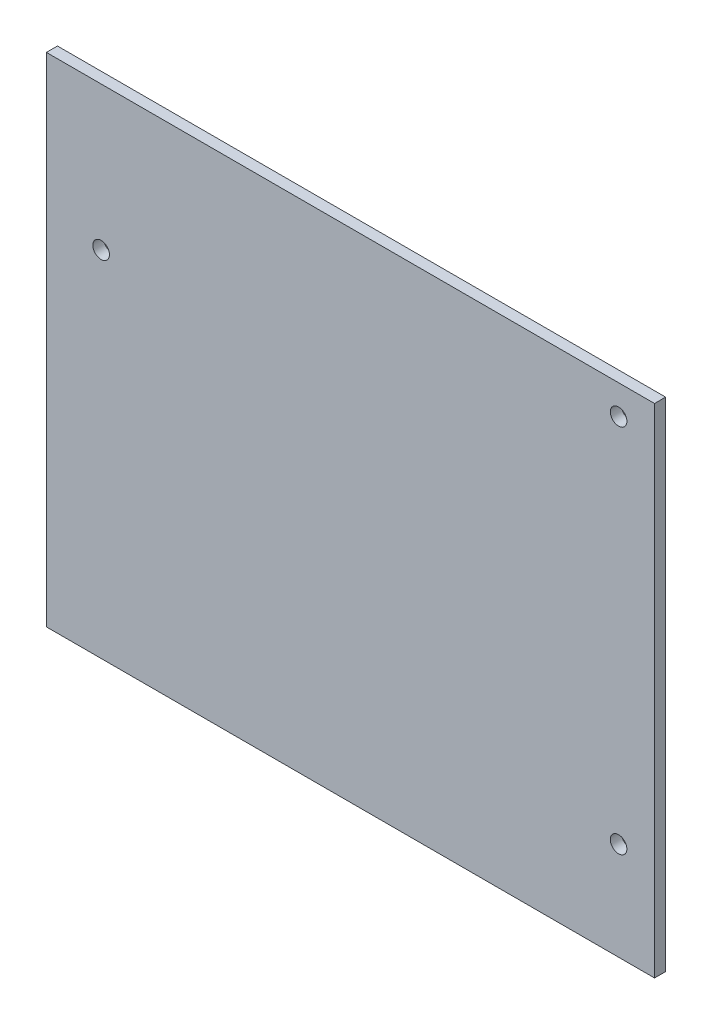
ISO-10303-21;
HEADER;
FILE_DESCRIPTION(('STEP AP214'),'2;1');
FILE_NAME('part.step','',(''),(''),'','','');
FILE_SCHEMA(('AUTOMOTIVE_DESIGN { 1 0 10303 214 1 1 1 1 }'));
ENDSEC;
DATA;
#1=APPLICATION_CONTEXT('core data for automotive mechanical design processes');
#2=APPLICATION_PROTOCOL_DEFINITION('international standard','automotive_design',2000,#1);
#3=PRODUCT_CONTEXT('',#1,'mechanical');
#4=PRODUCT('Part','Part','',(#3));
#5=PRODUCT_RELATED_PRODUCT_CATEGORY('part','',(#4));
#6=PRODUCT_DEFINITION_FORMATION('','',#4);
#7=PRODUCT_DEFINITION_CONTEXT('part definition',#1,'design');
#8=PRODUCT_DEFINITION('design','',#6,#7);
#9=PRODUCT_DEFINITION_SHAPE('','',#8);
#10=(LENGTH_UNIT() NAMED_UNIT(*) SI_UNIT(.MILLI.,.METRE.));
#11=(NAMED_UNIT(*) PLANE_ANGLE_UNIT() SI_UNIT($,.RADIAN.));
#12=(NAMED_UNIT(*) SI_UNIT($,.STERADIAN.) SOLID_ANGLE_UNIT());
#13=UNCERTAINTY_MEASURE_WITH_UNIT(LENGTH_MEASURE(1.E-05),#10,'distance_accuracy_value','');
#14=(GEOMETRIC_REPRESENTATION_CONTEXT(3) GLOBAL_UNCERTAINTY_ASSIGNED_CONTEXT((#13)) GLOBAL_UNIT_ASSIGNED_CONTEXT((#10,
#11,#12)) REPRESENTATION_CONTEXT('',''));
#15=CARTESIAN_POINT('',(0.,0.,0.));
#16=DIRECTION('',(0.,0.,1.));
#17=DIRECTION('',(1.,0.,0.));
#18=AXIS2_PLACEMENT_3D('',#15,#16,#17);
#19=CARTESIAN_POINT('',(55.,45.,2.));
#20=DIRECTION('',(0.,0.,-1.));
#21=DIRECTION('',(-1.,0.,0.));
#22=AXIS2_PLACEMENT_3D('',#19,#20,#21);
#23=PLANE('',#22);
#24=CARTESIAN_POINT('',(-45.1,19.,2.));
#25=DIRECTION('',(0.,0.,1.));
#26=DIRECTION('',(1.,0.,0.));
#27=AXIS2_PLACEMENT_3D('',#24,#25,#26);
#28=CIRCLE('',#27,1.5);
#29=CARTESIAN_POINT('',(-43.6,19.,2.));
#30=VERTEX_POINT('',#29);
#31=EDGE_CURVE('E114',#30,#30,#28,.T.);
#32=ORIENTED_EDGE('',*,*,#31,.F.);
#33=EDGE_LOOP('',(#32));
#34=FACE_BOUND('',#33,.T.);
#35=DIRECTION('',(0.,1.,0.));
#36=VECTOR('',#35,1.);
#37=CARTESIAN_POINT('',(55.,-45.,2.));
#38=LINE('',#37,#36);
#39=CARTESIAN_POINT('',(55.,-45.,2.));
#40=VERTEX_POINT('',#39);
#41=CARTESIAN_POINT('',(55.,45.,2.));
#42=VERTEX_POINT('',#41);
#43=EDGE_CURVE('E84',#40,#42,#38,.T.);
#44=ORIENTED_EDGE('',*,*,#43,.T.);
#45=DIRECTION('',(-1.,0.,0.));
#46=VECTOR('',#45,1.);
#47=CARTESIAN_POINT('',(-55.,45.,2.));
#48=LINE('',#47,#46);
#49=CARTESIAN_POINT('',(-55.,45.,2.));
#50=VERTEX_POINT('',#49);
#51=EDGE_CURVE('E79',#42,#50,#48,.T.);
#52=ORIENTED_EDGE('',*,*,#51,.T.);
#53=DIRECTION('',(0.,-1.,0.));
#54=VECTOR('',#53,1.);
#55=CARTESIAN_POINT('',(-55.,-45.,2.));
#56=LINE('',#55,#54);
#57=CARTESIAN_POINT('',(-55.,-45.,2.));
#58=VERTEX_POINT('',#57);
#59=EDGE_CURVE('E82',#50,#58,#56,.T.);
#60=ORIENTED_EDGE('',*,*,#59,.T.);
#61=DIRECTION('',(1.,0.,0.));
#62=VECTOR('',#61,1.);
#63=CARTESIAN_POINT('',(-55.,-45.,2.));
#64=LINE('',#63,#62);
#65=EDGE_CURVE('E49',#58,#40,#64,.T.);
#66=ORIENTED_EDGE('',*,*,#65,.T.);
#67=EDGE_LOOP('',(#44,#52,#60,#66));
#68=FACE_BOUND('',#67,.T.);
#69=CARTESIAN_POINT('',(48.5,39.7,2.));
#70=DIRECTION('',(0.,0.,1.));
#71=DIRECTION('',(1.,0.,0.));
#72=AXIS2_PLACEMENT_3D('',#69,#70,#71);
#73=CIRCLE('',#72,1.5);
#74=CARTESIAN_POINT('',(50.,39.7,2.));
#75=VERTEX_POINT('',#74);
#76=EDGE_CURVE('E99',#75,#75,#73,.T.);
#77=ORIENTED_EDGE('',*,*,#76,.F.);
#78=EDGE_LOOP('',(#77));
#79=FACE_BOUND('',#78,.T.);
#80=CARTESIAN_POINT('',(48.5,-27.3,2.));
#81=DIRECTION('',(0.,0.,1.));
#82=DIRECTION('',(1.,0.,0.));
#83=AXIS2_PLACEMENT_3D('',#80,#81,#82);
#84=CIRCLE('',#83,1.5);
#85=CARTESIAN_POINT('',(50.,-27.3,2.));
#86=VERTEX_POINT('',#85);
#87=EDGE_CURVE('E120',#86,#86,#84,.T.);
#88=ORIENTED_EDGE('',*,*,#87,.F.);
#89=EDGE_LOOP('',(#88));
#90=FACE_BOUND('',#89,.T.);
#91=ADVANCED_FACE('F32',(#34,#68,#79,#90),#23,.F.);
#92=CARTESIAN_POINT('',(55.,45.,0.));
#93=DIRECTION('',(0.,0.,-1.));
#94=DIRECTION('',(-1.,0.,0.));
#95=AXIS2_PLACEMENT_3D('',#92,#93,#94);
#96=PLANE('',#95);
#97=CARTESIAN_POINT('',(-45.1,19.,0.));
#98=DIRECTION('',(0.,0.,1.));
#99=DIRECTION('',(1.,0.,0.));
#100=AXIS2_PLACEMENT_3D('',#97,#98,#99);
#101=CIRCLE('',#100,1.5);
#102=CARTESIAN_POINT('',(-43.6,19.,0.));
#103=VERTEX_POINT('',#102);
#104=EDGE_CURVE('E117',#103,#103,#101,.T.);
#105=ORIENTED_EDGE('',*,*,#104,.T.);
#106=EDGE_LOOP('',(#105));
#107=FACE_BOUND('',#106,.T.);
#108=DIRECTION('',(0.,1.,0.));
#109=VECTOR('',#108,1.);
#110=CARTESIAN_POINT('',(55.,-45.,0.));
#111=LINE('',#110,#109);
#112=CARTESIAN_POINT('',(55.,-45.,0.));
#113=VERTEX_POINT('',#112);
#114=CARTESIAN_POINT('',(55.,45.,0.));
#115=VERTEX_POINT('',#114);
#116=EDGE_CURVE('E96',#113,#115,#111,.T.);
#117=ORIENTED_EDGE('',*,*,#116,.F.);
#118=DIRECTION('',(1.,0.,0.));
#119=VECTOR('',#118,1.);
#120=CARTESIAN_POINT('',(-55.,-45.,0.));
#121=LINE('',#120,#119);
#122=CARTESIAN_POINT('',(-55.,-45.,0.));
#123=VERTEX_POINT('',#122);
#124=EDGE_CURVE('E72',#123,#113,#121,.T.);
#125=ORIENTED_EDGE('',*,*,#124,.F.);
#126=DIRECTION('',(0.,-1.,0.));
#127=VECTOR('',#126,1.);
#128=CARTESIAN_POINT('',(-55.,-45.,0.));
#129=LINE('',#128,#127);
#130=CARTESIAN_POINT('',(-55.,45.,0.));
#131=VERTEX_POINT('',#130);
#132=EDGE_CURVE('E66',#131,#123,#129,.T.);
#133=ORIENTED_EDGE('',*,*,#132,.F.);
#134=DIRECTION('',(-1.,0.,0.));
#135=VECTOR('',#134,1.);
#136=CARTESIAN_POINT('',(-55.,45.,0.));
#137=LINE('',#136,#135);
#138=EDGE_CURVE('E88',#115,#131,#137,.T.);
#139=ORIENTED_EDGE('',*,*,#138,.F.);
#140=EDGE_LOOP('',(#117,#125,#133,#139));
#141=FACE_BOUND('',#140,.T.);
#142=CARTESIAN_POINT('',(48.5,39.7,0.));
#143=DIRECTION('',(0.,0.,1.));
#144=DIRECTION('',(1.,0.,0.));
#145=AXIS2_PLACEMENT_3D('',#142,#143,#144);
#146=CIRCLE('',#145,1.5);
#147=CARTESIAN_POINT('',(50.,39.7,0.));
#148=VERTEX_POINT('',#147);
#149=EDGE_CURVE('E111',#148,#148,#146,.T.);
#150=ORIENTED_EDGE('',*,*,#149,.T.);
#151=EDGE_LOOP('',(#150));
#152=FACE_BOUND('',#151,.T.);
#153=CARTESIAN_POINT('',(48.5,-27.3,0.));
#154=DIRECTION('',(0.,0.,1.));
#155=DIRECTION('',(1.,0.,0.));
#156=AXIS2_PLACEMENT_3D('',#153,#154,#155);
#157=CIRCLE('',#156,1.5);
#158=CARTESIAN_POINT('',(50.,-27.3,0.));
#159=VERTEX_POINT('',#158);
#160=EDGE_CURVE('E123',#159,#159,#157,.T.);
#161=ORIENTED_EDGE('',*,*,#160,.T.);
#162=EDGE_LOOP('',(#161));
#163=FACE_BOUND('',#162,.T.);
#164=ADVANCED_FACE('F107',(#107,#141,#152,#163),#96,.T.);
#165=CARTESIAN_POINT('',(55.,-45.,2.));
#166=DIRECTION('',(-1.,0.,0.));
#167=DIRECTION('',(0.,0.,1.));
#168=AXIS2_PLACEMENT_3D('',#165,#166,#167);
#169=PLANE('',#168);
#170=ORIENTED_EDGE('',*,*,#116,.T.);
#171=DIRECTION('',(0.,0.,-1.));
#172=VECTOR('',#171,1.);
#173=CARTESIAN_POINT('',(55.,45.,2.));
#174=LINE('',#173,#172);
#175=EDGE_CURVE('E11',#42,#115,#174,.T.);
#176=ORIENTED_EDGE('',*,*,#175,.F.);
#177=ORIENTED_EDGE('',*,*,#43,.F.);
#178=DIRECTION('',(0.,0.,-1.));
#179=VECTOR('',#178,1.);
#180=CARTESIAN_POINT('',(55.,-45.,2.));
#181=LINE('',#180,#179);
#182=EDGE_CURVE('E92',#40,#113,#181,.T.);
#183=ORIENTED_EDGE('',*,*,#182,.T.);
#184=EDGE_LOOP('',(#170,#176,#177,#183));
#185=FACE_BOUND('',#184,.T.);
#186=ADVANCED_FACE('F34',(#185),#169,.F.);
#187=CARTESIAN_POINT('',(-55.,45.,2.));
#188=DIRECTION('',(0.,-1.,0.));
#189=DIRECTION('',(0.,0.,-1.));
#190=AXIS2_PLACEMENT_3D('',#187,#188,#189);
#191=PLANE('',#190);
#192=ORIENTED_EDGE('',*,*,#138,.T.);
#193=DIRECTION('',(0.,0.,-1.));
#194=VECTOR('',#193,1.);
#195=CARTESIAN_POINT('',(-55.,45.,2.));
#196=LINE('',#195,#194);
#197=EDGE_CURVE('E41',#50,#131,#196,.T.);
#198=ORIENTED_EDGE('',*,*,#197,.F.);
#199=ORIENTED_EDGE('',*,*,#51,.F.);
#200=ORIENTED_EDGE('',*,*,#175,.T.);
#201=EDGE_LOOP('',(#192,#198,#199,#200));
#202=FACE_BOUND('',#201,.T.);
#203=ADVANCED_FACE('F87',(#202),#191,.F.);
#204=CARTESIAN_POINT('',(-55.,-45.,2.));
#205=DIRECTION('',(1.,0.,0.));
#206=DIRECTION('',(0.,0.,-1.));
#207=AXIS2_PLACEMENT_3D('',#204,#205,#206);
#208=PLANE('',#207);
#209=ORIENTED_EDGE('',*,*,#132,.T.);
#210=DIRECTION('',(0.,0.,-1.));
#211=VECTOR('',#210,1.);
#212=CARTESIAN_POINT('',(-55.,-45.,2.));
#213=LINE('',#212,#211);
#214=EDGE_CURVE('E89',#58,#123,#213,.T.);
#215=ORIENTED_EDGE('',*,*,#214,.F.);
#216=ORIENTED_EDGE('',*,*,#59,.F.);
#217=ORIENTED_EDGE('',*,*,#197,.T.);
#218=EDGE_LOOP('',(#209,#215,#216,#217));
#219=FACE_BOUND('',#218,.T.);
#220=ADVANCED_FACE('F90',(#219),#208,.F.);
#221=CARTESIAN_POINT('',(-55.,-45.,2.));
#222=DIRECTION('',(0.,1.,0.));
#223=DIRECTION('',(0.,0.,1.));
#224=AXIS2_PLACEMENT_3D('',#221,#222,#223);
#225=PLANE('',#224);
#226=ORIENTED_EDGE('',*,*,#124,.T.);
#227=ORIENTED_EDGE('',*,*,#182,.F.);
#228=ORIENTED_EDGE('',*,*,#65,.F.);
#229=ORIENTED_EDGE('',*,*,#214,.T.);
#230=EDGE_LOOP('',(#226,#227,#228,#229));
#231=FACE_BOUND('',#230,.T.);
#232=ADVANCED_FACE('F104',(#231),#225,.F.);
#233=CARTESIAN_POINT('',(48.5,39.7,2.));
#234=DIRECTION('',(0.,0.,-1.));
#235=DIRECTION('',(-1.,0.,0.));
#236=AXIS2_PLACEMENT_3D('',#233,#234,#235);
#237=CYLINDRICAL_SURFACE('',#236,1.5);
#238=ORIENTED_EDGE('',*,*,#76,.T.);
#239=EDGE_LOOP('',(#238));
#240=FACE_BOUND('',#239,.T.);
#241=ORIENTED_EDGE('',*,*,#149,.F.);
#242=EDGE_LOOP('',(#241));
#243=FACE_BOUND('',#242,.T.);
#244=ADVANCED_FACE('F142',(#240,#243),#237,.F.);
#245=CARTESIAN_POINT('',(-45.1,19.,2.));
#246=DIRECTION('',(0.,0.,-1.));
#247=DIRECTION('',(-1.,0.,0.));
#248=AXIS2_PLACEMENT_3D('',#245,#246,#247);
#249=CYLINDRICAL_SURFACE('',#248,1.5);
#250=ORIENTED_EDGE('',*,*,#31,.T.);
#251=EDGE_LOOP('',(#250));
#252=FACE_BOUND('',#251,.T.);
#253=ORIENTED_EDGE('',*,*,#104,.F.);
#254=EDGE_LOOP('',(#253));
#255=FACE_BOUND('',#254,.T.);
#256=ADVANCED_FACE('F188',(#252,#255),#249,.F.);
#257=CARTESIAN_POINT('',(48.5,-27.3,2.));
#258=DIRECTION('',(0.,0.,-1.));
#259=DIRECTION('',(-1.,0.,0.));
#260=AXIS2_PLACEMENT_3D('',#257,#258,#259);
#261=CYLINDRICAL_SURFACE('',#260,1.5);
#262=ORIENTED_EDGE('',*,*,#87,.T.);
#263=EDGE_LOOP('',(#262));
#264=FACE_BOUND('',#263,.T.);
#265=ORIENTED_EDGE('',*,*,#160,.F.);
#266=EDGE_LOOP('',(#265));
#267=FACE_BOUND('',#266,.T.);
#268=ADVANCED_FACE('F129',(#264,#267),#261,.F.);
#269=CLOSED_SHELL('',(#91,#164,#186,#203,#220,#232,#244,#256,#268));
#270=MANIFOLD_SOLID_BREP('B2',#269);
#271=ADVANCED_BREP_SHAPE_REPRESENTATION('',(#18,#270),#14);
#272=SHAPE_DEFINITION_REPRESENTATION(#9,#271);
ENDSEC;
END-ISO-10303-21;
